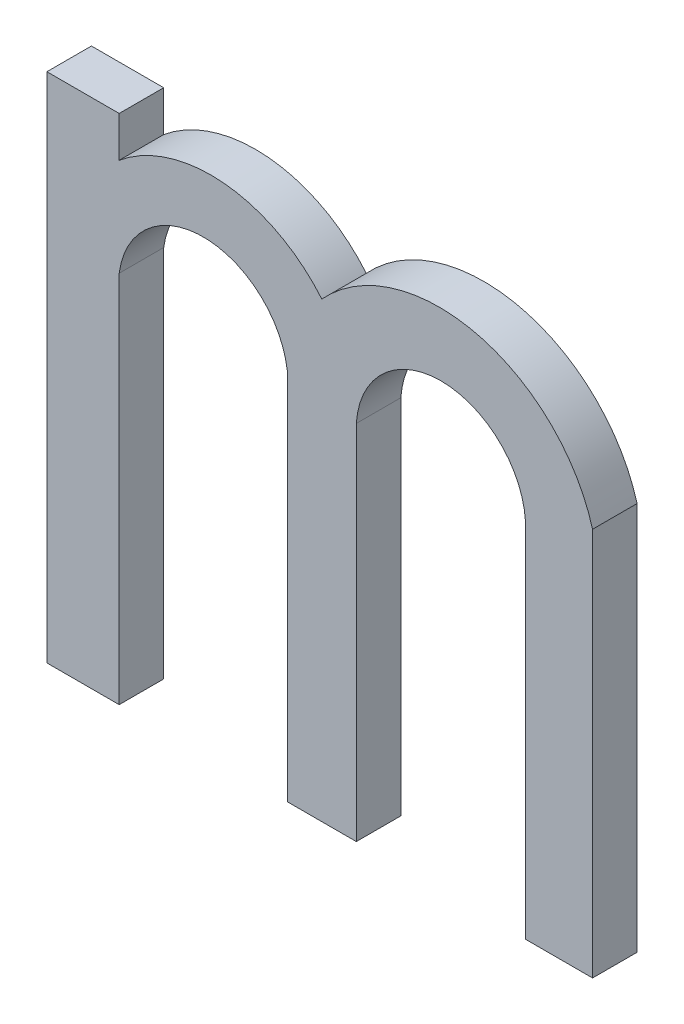
ISO-10303-21;
HEADER;
FILE_DESCRIPTION(('STEP AP214'),'2;1');
FILE_NAME('part.step','',(''),(''),'','','');
FILE_SCHEMA(('AUTOMOTIVE_DESIGN { 1 0 10303 214 1 1 1 1 }'));
ENDSEC;
DATA;
#1=APPLICATION_CONTEXT('core data for automotive mechanical design processes');
#2=APPLICATION_PROTOCOL_DEFINITION('international standard','automotive_design',2000,#1);
#3=PRODUCT_CONTEXT('',#1,'mechanical');
#4=PRODUCT('Part','Part','',(#3));
#5=PRODUCT_RELATED_PRODUCT_CATEGORY('part','',(#4));
#6=PRODUCT_DEFINITION_FORMATION('','',#4);
#7=PRODUCT_DEFINITION_CONTEXT('part definition',#1,'design');
#8=PRODUCT_DEFINITION('design','',#6,#7);
#9=PRODUCT_DEFINITION_SHAPE('','',#8);
#10=(LENGTH_UNIT() NAMED_UNIT(*) SI_UNIT(.MILLI.,.METRE.));
#11=(NAMED_UNIT(*) PLANE_ANGLE_UNIT() SI_UNIT($,.RADIAN.));
#12=(NAMED_UNIT(*) SI_UNIT($,.STERADIAN.) SOLID_ANGLE_UNIT());
#13=UNCERTAINTY_MEASURE_WITH_UNIT(LENGTH_MEASURE(1.E-05),#10,'distance_accuracy_value','');
#14=(GEOMETRIC_REPRESENTATION_CONTEXT(3) GLOBAL_UNCERTAINTY_ASSIGNED_CONTEXT((#13)) GLOBAL_UNIT_ASSIGNED_CONTEXT((#10,
#11,#12)) REPRESENTATION_CONTEXT('',''));
#15=CARTESIAN_POINT('',(0.,0.,0.));
#16=DIRECTION('',(0.,0.,1.));
#17=DIRECTION('',(1.,0.,0.));
#18=AXIS2_PLACEMENT_3D('',#15,#16,#17);
#19=CARTESIAN_POINT('',(0.490687253635956,-0.901080123716433,-0.005));
#20=DIRECTION('',(0.,0.,1.));
#21=DIRECTION('',(1.,0.,0.));
#22=AXIS2_PLACEMENT_3D('',#19,#20,#21);
#23=CYLINDRICAL_SURFACE('',#22,0.0357735525383627);
#24=DIRECTION('',(0.,0.,1.));
#25=VECTOR('',#24,1.);
#26=CARTESIAN_POINT('',(0.464282901755146,-0.876943900669541,-0.005));
#27=LINE('',#26,#25);
#28=CARTESIAN_POINT('',(0.464282901755146,-0.876943900669541,-0.005));
#29=VERTEX_POINT('',#28);
#30=CARTESIAN_POINT('',(0.464282901755146,-0.876943900669541,0.005));
#31=VERTEX_POINT('',#30);
#32=EDGE_CURVE('E11',#29,#31,#27,.T.);
#33=ORIENTED_EDGE('',*,*,#32,.T.);
#34=CARTESIAN_POINT('',(0.490687253635956,-0.901080123716433,0.005));
#35=DIRECTION('',(0.,0.,-1.));
#36=DIRECTION('',(1.,0.,0.));
#37=AXIS2_PLACEMENT_3D('',#34,#35,#36);
#38=CIRCLE('',#37,0.0357735525383627);
#39=CARTESIAN_POINT('',(0.525098674552369,-0.891302538547872,0.005));
#40=VERTEX_POINT('',#39);
#41=EDGE_CURVE('E24',#31,#40,#38,.T.);
#42=ORIENTED_EDGE('',*,*,#41,.T.);
#43=DIRECTION('',(0.,0.,1.));
#44=VECTOR('',#43,1.);
#45=CARTESIAN_POINT('',(0.525098674552369,-0.891302538547872,-0.005));
#46=LINE('',#45,#44);
#47=CARTESIAN_POINT('',(0.525098674552369,-0.891302538547872,-0.005));
#48=VERTEX_POINT('',#47);
#49=EDGE_CURVE('E246',#48,#40,#46,.T.);
#50=ORIENTED_EDGE('',*,*,#49,.F.);
#51=CARTESIAN_POINT('',(0.490687253635956,-0.901080123716433,-0.005));
#52=DIRECTION('',(0.,0.,-1.));
#53=DIRECTION('',(1.,0.,0.));
#54=AXIS2_PLACEMENT_3D('',#51,#52,#53);
#55=CIRCLE('',#54,0.0357735525383627);
#56=EDGE_CURVE('E244',#29,#48,#55,.T.);
#57=ORIENTED_EDGE('',*,*,#56,.F.);
#58=EDGE_LOOP('',(#33,#42,#50,#57));
#59=FACE_BOUND('',#58,.T.);
#60=ADVANCED_FACE('F17',(#59),#23,.T.);
#61=CARTESIAN_POINT('',(0.525098674552368,0.,-0.005));
#62=DIRECTION('',(1.,0.,0.));
#63=DIRECTION('',(0.,1.,0.));
#64=AXIS2_PLACEMENT_3D('',#61,#62,#63);
#65=PLANE('',#64);
#66=ORIENTED_EDGE('',*,*,#49,.T.);
#67=DIRECTION('',(0.,1.,0.));
#68=VECTOR('',#67,1.);
#69=CARTESIAN_POINT('',(0.525098674552368,0.,0.005));
#70=LINE('',#69,#68);
#71=CARTESIAN_POINT('',(0.525098674552369,-0.978587788073794,0.005));
#72=VERTEX_POINT('',#71);
#73=EDGE_CURVE('E241',#72,#40,#70,.T.);
#74=ORIENTED_EDGE('',*,*,#73,.F.);
#75=DIRECTION('',(0.,0.,1.));
#76=VECTOR('',#75,1.);
#77=CARTESIAN_POINT('',(0.525098674552369,-0.978587788073794,-0.005));
#78=LINE('',#77,#76);
#79=CARTESIAN_POINT('',(0.525098674552369,-0.978587788073794,-0.005));
#80=VERTEX_POINT('',#79);
#81=EDGE_CURVE('E238',#80,#72,#78,.T.);
#82=ORIENTED_EDGE('',*,*,#81,.F.);
#83=DIRECTION('',(0.,1.,0.));
#84=VECTOR('',#83,1.);
#85=CARTESIAN_POINT('',(0.525098674552368,0.,-0.005));
#86=LINE('',#85,#84);
#87=EDGE_CURVE('E235',#80,#48,#86,.T.);
#88=ORIENTED_EDGE('',*,*,#87,.T.);
#89=EDGE_LOOP('',(#66,#74,#82,#88));
#90=FACE_BOUND('',#89,.T.);
#91=ADVANCED_FACE('F250',(#90),#65,.T.);
#92=CARTESIAN_POINT('',(0.,-0.978587788073794,-0.005));
#93=DIRECTION('',(0.,1.,0.));
#94=DIRECTION('',(0.,0.,1.));
#95=AXIS2_PLACEMENT_3D('',#92,#93,#94);
#96=PLANE('',#95);
#97=ORIENTED_EDGE('',*,*,#81,.T.);
#98=DIRECTION('',(-1.,0.,0.));
#99=VECTOR('',#98,1.);
#100=CARTESIAN_POINT('',(0.,-0.978587788073794,0.005));
#101=LINE('',#100,#99);
#102=CARTESIAN_POINT('',(0.51002706613578,-0.978587788073794,0.005));
#103=VERTEX_POINT('',#102);
#104=EDGE_CURVE('E233',#72,#103,#101,.T.);
#105=ORIENTED_EDGE('',*,*,#104,.T.);
#106=DIRECTION('',(0.,0.,1.));
#107=VECTOR('',#106,1.);
#108=CARTESIAN_POINT('',(0.51002706613578,-0.978587788073794,-0.005));
#109=LINE('',#108,#107);
#110=CARTESIAN_POINT('',(0.51002706613578,-0.978587788073794,-0.005));
#111=VERTEX_POINT('',#110);
#112=EDGE_CURVE('E230',#111,#103,#109,.T.);
#113=ORIENTED_EDGE('',*,*,#112,.F.);
#114=DIRECTION('',(-1.,0.,0.));
#115=VECTOR('',#114,1.);
#116=CARTESIAN_POINT('',(0.,-0.978587788073794,-0.005));
#117=LINE('',#116,#115);
#118=EDGE_CURVE('E227',#80,#111,#117,.T.);
#119=ORIENTED_EDGE('',*,*,#118,.F.);
#120=EDGE_LOOP('',(#97,#105,#113,#119));
#121=FACE_BOUND('',#120,.T.);
#122=ADVANCED_FACE('F256',(#121),#96,.F.);
#123=CARTESIAN_POINT('',(0.51002706613578,0.,-0.005));
#124=DIRECTION('',(1.,0.,0.));
#125=DIRECTION('',(0.,0.,-1.));
#126=AXIS2_PLACEMENT_3D('',#123,#124,#125);
#127=PLANE('',#126);
#128=ORIENTED_EDGE('',*,*,#112,.T.);
#129=DIRECTION('',(0.,1.,0.));
#130=VECTOR('',#129,1.);
#131=CARTESIAN_POINT('',(0.51002706613578,0.,0.005));
#132=LINE('',#131,#130);
#133=CARTESIAN_POINT('',(0.51002706613578,-0.897255148385557,0.005));
#134=VERTEX_POINT('',#133);
#135=EDGE_CURVE('E225',#103,#134,#132,.T.);
#136=ORIENTED_EDGE('',*,*,#135,.T.);
#137=DIRECTION('',(0.,0.,1.));
#138=VECTOR('',#137,1.);
#139=CARTESIAN_POINT('',(0.51002706613578,-0.897255148385557,-0.005));
#140=LINE('',#139,#138);
#141=CARTESIAN_POINT('',(0.51002706613578,-0.897255148385557,-0.005));
#142=VERTEX_POINT('',#141);
#143=EDGE_CURVE('E222',#142,#134,#140,.T.);
#144=ORIENTED_EDGE('',*,*,#143,.F.);
#145=DIRECTION('',(0.,1.,0.));
#146=VECTOR('',#145,1.);
#147=CARTESIAN_POINT('',(0.51002706613578,0.,-0.005));
#148=LINE('',#147,#146);
#149=EDGE_CURVE('E219',#111,#142,#148,.T.);
#150=ORIENTED_EDGE('',*,*,#149,.F.);
#151=EDGE_LOOP('',(#128,#136,#144,#150));
#152=FACE_BOUND('',#151,.T.);
#153=ADVANCED_FACE('F260',(#152),#127,.F.);
#154=CARTESIAN_POINT('',(0.491031608045504,-0.898499238705807,-0.005));
#155=DIRECTION('',(0.,0.,1.));
#156=DIRECTION('',(1.,0.,0.));
#157=AXIS2_PLACEMENT_3D('',#154,#155,#156);
#158=CYLINDRICAL_SURFACE('',#157,0.0190361547793761);
#159=ORIENTED_EDGE('',*,*,#143,.T.);
#160=CARTESIAN_POINT('',(0.491031608045504,-0.898499238705807,0.005));
#161=DIRECTION('',(0.,0.,-1.));
#162=DIRECTION('',(1.,0.,0.));
#163=AXIS2_PLACEMENT_3D('',#160,#161,#162);
#164=CIRCLE('',#163,0.0190361547793761);
#165=CARTESIAN_POINT('',(0.472036149955228,-0.897255148385558,0.005));
#166=VERTEX_POINT('',#165);
#167=EDGE_CURVE('E216',#166,#134,#164,.T.);
#168=ORIENTED_EDGE('',*,*,#167,.F.);
#169=DIRECTION('',(0.,0.,1.));
#170=VECTOR('',#169,1.);
#171=CARTESIAN_POINT('',(0.472036149955228,-0.897255148385558,-0.005));
#172=LINE('',#171,#170);
#173=CARTESIAN_POINT('',(0.472036149955228,-0.897255148385558,-0.005));
#174=VERTEX_POINT('',#173);
#175=EDGE_CURVE('E214',#174,#166,#172,.T.);
#176=ORIENTED_EDGE('',*,*,#175,.F.);
#177=CARTESIAN_POINT('',(0.491031608045504,-0.898499238705807,-0.005));
#178=DIRECTION('',(0.,0.,-1.));
#179=DIRECTION('',(1.,0.,0.));
#180=AXIS2_PLACEMENT_3D('',#177,#178,#179);
#181=CIRCLE('',#180,0.0190361547793761);
#182=EDGE_CURVE('E211',#174,#142,#181,.T.);
#183=ORIENTED_EDGE('',*,*,#182,.T.);
#184=EDGE_LOOP('',(#159,#168,#176,#183));
#185=FACE_BOUND('',#184,.T.);
#186=ADVANCED_FACE('F264',(#185),#158,.F.);
#187=CARTESIAN_POINT('',(0.472036149955228,0.,-0.005));
#188=DIRECTION('',(1.,0.,0.));
#189=DIRECTION('',(0.,0.,-1.));
#190=AXIS2_PLACEMENT_3D('',#187,#188,#189);
#191=PLANE('',#190);
#192=ORIENTED_EDGE('',*,*,#175,.T.);
#193=DIRECTION('',(0.,1.,0.));
#194=VECTOR('',#193,1.);
#195=CARTESIAN_POINT('',(0.472036149955228,0.,0.005));
#196=LINE('',#195,#194);
#197=CARTESIAN_POINT('',(0.472036149955228,-0.978587788073794,0.005));
#198=VERTEX_POINT('',#197);
#199=EDGE_CURVE('E208',#198,#166,#196,.T.);
#200=ORIENTED_EDGE('',*,*,#199,.F.);
#201=DIRECTION('',(0.,0.,1.));
#202=VECTOR('',#201,1.);
#203=CARTESIAN_POINT('',(0.472036149955228,-0.978587788073794,-0.005));
#204=LINE('',#203,#202);
#205=CARTESIAN_POINT('',(0.472036149955228,-0.978587788073794,-0.005));
#206=VERTEX_POINT('',#205);
#207=EDGE_CURVE('E205',#206,#198,#204,.T.);
#208=ORIENTED_EDGE('',*,*,#207,.F.);
#209=DIRECTION('',(0.,1.,0.));
#210=VECTOR('',#209,1.);
#211=CARTESIAN_POINT('',(0.472036149955228,0.,-0.005));
#212=LINE('',#211,#210);
#213=EDGE_CURVE('E202',#206,#174,#212,.T.);
#214=ORIENTED_EDGE('',*,*,#213,.T.);
#215=EDGE_LOOP('',(#192,#200,#208,#214));
#216=FACE_BOUND('',#215,.T.);
#217=ADVANCED_FACE('F267',(#216),#191,.T.);
#218=CARTESIAN_POINT('',(0.,-0.978587788073794,-0.005));
#219=DIRECTION('',(0.,-1.,0.));
#220=DIRECTION('',(0.,0.,-1.));
#221=AXIS2_PLACEMENT_3D('',#218,#219,#220);
#222=PLANE('',#221);
#223=ORIENTED_EDGE('',*,*,#207,.T.);
#224=DIRECTION('',(1.,0.,0.));
#225=VECTOR('',#224,1.);
#226=CARTESIAN_POINT('',(0.,-0.978587788073794,0.005));
#227=LINE('',#226,#225);
#228=CARTESIAN_POINT('',(0.456529653555003,-0.978587788073794,0.005));
#229=VERTEX_POINT('',#228);
#230=EDGE_CURVE('E199',#229,#198,#227,.T.);
#231=ORIENTED_EDGE('',*,*,#230,.F.);
#232=DIRECTION('',(0.,0.,1.));
#233=VECTOR('',#232,1.);
#234=CARTESIAN_POINT('',(0.456529653555003,-0.978587788073794,-0.005));
#235=LINE('',#234,#233);
#236=CARTESIAN_POINT('',(0.456529653555003,-0.978587788073794,-0.005));
#237=VERTEX_POINT('',#236);
#238=EDGE_CURVE('E196',#237,#229,#235,.T.);
#239=ORIENTED_EDGE('',*,*,#238,.F.);
#240=DIRECTION('',(1.,0.,0.));
#241=VECTOR('',#240,1.);
#242=CARTESIAN_POINT('',(0.,-0.978587788073794,-0.005));
#243=LINE('',#242,#241);
#244=EDGE_CURVE('E193',#237,#206,#243,.T.);
#245=ORIENTED_EDGE('',*,*,#244,.T.);
#246=EDGE_LOOP('',(#223,#231,#239,#245));
#247=FACE_BOUND('',#246,.T.);
#248=ADVANCED_FACE('F271',(#247),#222,.T.);
#249=CARTESIAN_POINT('',(0.456529653555003,0.,-0.005));
#250=DIRECTION('',(1.,0.,0.));
#251=DIRECTION('',(0.,0.,-1.));
#252=AXIS2_PLACEMENT_3D('',#249,#250,#251);
#253=PLANE('',#252);
#254=ORIENTED_EDGE('',*,*,#238,.T.);
#255=DIRECTION('',(0.,1.,0.));
#256=VECTOR('',#255,1.);
#257=CARTESIAN_POINT('',(0.456529653555003,0.,0.005));
#258=LINE('',#257,#256);
#259=CARTESIAN_POINT('',(0.456529653555003,-0.894671181364844,0.005));
#260=VERTEX_POINT('',#259);
#261=EDGE_CURVE('E191',#229,#260,#258,.T.);
#262=ORIENTED_EDGE('',*,*,#261,.T.);
#263=DIRECTION('',(0.,0.,1.));
#264=VECTOR('',#263,1.);
#265=CARTESIAN_POINT('',(0.456529653555003,-0.894671181364844,-0.005));
#266=LINE('',#265,#264);
#267=CARTESIAN_POINT('',(0.456529653555003,-0.894671181364844,-0.005));
#268=VERTEX_POINT('',#267);
#269=EDGE_CURVE('E188',#268,#260,#266,.T.);
#270=ORIENTED_EDGE('',*,*,#269,.F.);
#271=DIRECTION('',(0.,1.,0.));
#272=VECTOR('',#271,1.);
#273=CARTESIAN_POINT('',(0.456529653555003,0.,-0.005));
#274=LINE('',#273,#272);
#275=EDGE_CURVE('E185',#237,#268,#274,.T.);
#276=ORIENTED_EDGE('',*,*,#275,.F.);
#277=EDGE_LOOP('',(#254,#262,#270,#276));
#278=FACE_BOUND('',#277,.T.);
#279=ADVANCED_FACE('F274',(#278),#253,.F.);
#280=CARTESIAN_POINT('',(0.437653191428051,-0.89720725519545,-0.005));
#281=DIRECTION('',(0.,0.,1.));
#282=DIRECTION('',(1.,0.,0.));
#283=AXIS2_PLACEMENT_3D('',#280,#281,#282);
#284=CYLINDRICAL_SURFACE('',#283,0.0190460623989458);
#285=ORIENTED_EDGE('',*,*,#269,.T.);
#286=CARTESIAN_POINT('',(0.437653191428051,-0.89720725519545,0.005));
#287=DIRECTION('',(0.,0.,-1.));
#288=DIRECTION('',(1.,0.,0.));
#289=AXIS2_PLACEMENT_3D('',#286,#287,#288);
#290=CIRCLE('',#289,0.0190460623989458);
#291=CARTESIAN_POINT('',(0.418776729301099,-0.894671181364844,0.005));
#292=VERTEX_POINT('',#291);
#293=EDGE_CURVE('E182',#292,#260,#290,.T.);
#294=ORIENTED_EDGE('',*,*,#293,.F.);
#295=DIRECTION('',(0.,0.,1.));
#296=VECTOR('',#295,1.);
#297=CARTESIAN_POINT('',(0.418776729301099,-0.894671181364844,-0.005));
#298=LINE('',#297,#296);
#299=CARTESIAN_POINT('',(0.418776729301099,-0.894671181364844,-0.005));
#300=VERTEX_POINT('',#299);
#301=EDGE_CURVE('E180',#300,#292,#298,.T.);
#302=ORIENTED_EDGE('',*,*,#301,.F.);
#303=CARTESIAN_POINT('',(0.437653191428051,-0.89720725519545,-0.005));
#304=DIRECTION('',(0.,0.,-1.));
#305=DIRECTION('',(1.,0.,0.));
#306=AXIS2_PLACEMENT_3D('',#303,#304,#305);
#307=CIRCLE('',#306,0.0190460623989458);
#308=EDGE_CURVE('E177',#300,#268,#307,.T.);
#309=ORIENTED_EDGE('',*,*,#308,.T.);
#310=EDGE_LOOP('',(#285,#294,#302,#309));
#311=FACE_BOUND('',#310,.T.);
#312=ADVANCED_FACE('F278',(#311),#284,.F.);
#313=CARTESIAN_POINT('',(0.418776729301099,0.,-0.005));
#314=DIRECTION('',(1.,0.,0.));
#315=DIRECTION('',(0.,0.,-1.));
#316=AXIS2_PLACEMENT_3D('',#313,#314,#315);
#317=PLANE('',#316);
#318=ORIENTED_EDGE('',*,*,#301,.T.);
#319=DIRECTION('',(0.,1.,0.));
#320=VECTOR('',#319,1.);
#321=CARTESIAN_POINT('',(0.418776729301099,0.,0.005));
#322=LINE('',#321,#320);
#323=CARTESIAN_POINT('',(0.418776729301099,-0.978587788073793,0.005));
#324=VERTEX_POINT('',#323);
#325=EDGE_CURVE('E174',#324,#292,#322,.T.);
#326=ORIENTED_EDGE('',*,*,#325,.F.);
#327=DIRECTION('',(0.,0.,1.));
#328=VECTOR('',#327,1.);
#329=CARTESIAN_POINT('',(0.418776729301099,-0.978587788073793,-0.005));
#330=LINE('',#329,#328);
#331=CARTESIAN_POINT('',(0.418776729301099,-0.978587788073793,-0.005));
#332=VERTEX_POINT('',#331);
#333=EDGE_CURVE('E171',#332,#324,#330,.T.);
#334=ORIENTED_EDGE('',*,*,#333,.F.);
#335=DIRECTION('',(0.,1.,0.));
#336=VECTOR('',#335,1.);
#337=CARTESIAN_POINT('',(0.418776729301099,0.,-0.005));
#338=LINE('',#337,#336);
#339=EDGE_CURVE('E168',#332,#300,#338,.T.);
#340=ORIENTED_EDGE('',*,*,#339,.T.);
#341=EDGE_LOOP('',(#318,#326,#334,#340));
#342=FACE_BOUND('',#341,.T.);
#343=ADVANCED_FACE('F319',(#342),#317,.T.);
#344=CARTESIAN_POINT('',(0.,-0.978587788073793,-0.005));
#345=DIRECTION('',(0.,-1.,0.));
#346=DIRECTION('',(0.,0.,-1.));
#347=AXIS2_PLACEMENT_3D('',#344,#345,#346);
#348=PLANE('',#347);
#349=ORIENTED_EDGE('',*,*,#333,.T.);
#350=DIRECTION('',(1.,0.,0.));
#351=VECTOR('',#350,1.);
#352=CARTESIAN_POINT('',(0.,-0.978587788073793,0.005));
#353=LINE('',#352,#351);
#354=CARTESIAN_POINT('',(0.402544372421268,-0.978587788073793,0.005));
#355=VERTEX_POINT('',#354);
#356=EDGE_CURVE('E165',#355,#324,#353,.T.);
#357=ORIENTED_EDGE('',*,*,#356,.F.);
#358=DIRECTION('',(0.,0.,1.));
#359=VECTOR('',#358,1.);
#360=CARTESIAN_POINT('',(0.402544372421268,-0.978587788073793,-0.005));
#361=LINE('',#360,#359);
#362=CARTESIAN_POINT('',(0.402544372421268,-0.978587788073793,-0.005));
#363=VERTEX_POINT('',#362);
#364=EDGE_CURVE('E162',#363,#355,#361,.T.);
#365=ORIENTED_EDGE('',*,*,#364,.F.);
#366=DIRECTION('',(1.,0.,0.));
#367=VECTOR('',#366,1.);
#368=CARTESIAN_POINT('',(0.,-0.978587788073793,-0.005));
#369=LINE('',#368,#367);
#370=EDGE_CURVE('E159',#363,#332,#369,.T.);
#371=ORIENTED_EDGE('',*,*,#370,.T.);
#372=EDGE_LOOP('',(#349,#357,#365,#371));
#373=FACE_BOUND('',#372,.T.);
#374=ADVANCED_FACE('F283',(#373),#348,.T.);
#375=CARTESIAN_POINT('',(0.402544372421268,0.,-0.005));
#376=DIRECTION('',(-1.,0.,0.));
#377=DIRECTION('',(0.,0.,1.));
#378=AXIS2_PLACEMENT_3D('',#375,#376,#377);
#379=PLANE('',#378);
#380=ORIENTED_EDGE('',*,*,#364,.T.);
#381=DIRECTION('',(0.,-1.,0.));
#382=VECTOR('',#381,1.);
#383=CARTESIAN_POINT('',(0.402544372421268,0.,0.005));
#384=LINE('',#383,#382);
#385=CARTESIAN_POINT('',(0.402544372421268,-0.863587788073793,0.005));
#386=VERTEX_POINT('',#385);
#387=EDGE_CURVE('E156',#386,#355,#384,.T.);
#388=ORIENTED_EDGE('',*,*,#387,.F.);
#389=DIRECTION('',(0.,0.,1.));
#390=VECTOR('',#389,1.);
#391=CARTESIAN_POINT('',(0.402544372421268,-0.863587788073793,-0.005));
#392=LINE('',#391,#390);
#393=CARTESIAN_POINT('',(0.402544372421268,-0.863587788073793,-0.005));
#394=VERTEX_POINT('',#393);
#395=EDGE_CURVE('E153',#394,#386,#392,.T.);
#396=ORIENTED_EDGE('',*,*,#395,.F.);
#397=DIRECTION('',(0.,-1.,0.));
#398=VECTOR('',#397,1.);
#399=CARTESIAN_POINT('',(0.402544372421268,0.,-0.005));
#400=LINE('',#399,#398);
#401=EDGE_CURVE('E150',#394,#363,#400,.T.);
#402=ORIENTED_EDGE('',*,*,#401,.T.);
#403=EDGE_LOOP('',(#380,#388,#396,#402));
#404=FACE_BOUND('',#403,.T.);
#405=ADVANCED_FACE('F285',(#404),#379,.T.);
#406=CARTESIAN_POINT('',(0.,-0.863587788073793,-0.005));
#407=DIRECTION('',(0.,-1.,0.));
#408=DIRECTION('',(0.,0.,-1.));
#409=AXIS2_PLACEMENT_3D('',#406,#407,#408);
#410=PLANE('',#409);
#411=ORIENTED_EDGE('',*,*,#395,.T.);
#412=DIRECTION('',(1.,0.,0.));
#413=VECTOR('',#412,1.);
#414=CARTESIAN_POINT('',(0.,-0.863587788073793,0.005));
#415=LINE('',#414,#413);
#416=CARTESIAN_POINT('',(0.418776729301038,-0.863587788073793,0.005));
#417=VERTEX_POINT('',#416);
#418=EDGE_CURVE('E148',#386,#417,#415,.T.);
#419=ORIENTED_EDGE('',*,*,#418,.T.);
#420=DIRECTION('',(0.,0.,1.));
#421=VECTOR('',#420,1.);
#422=CARTESIAN_POINT('',(0.418776729301038,-0.863587788073793,-0.005));
#423=LINE('',#422,#421);
#424=CARTESIAN_POINT('',(0.418776729301038,-0.863587788073793,-0.005));
#425=VERTEX_POINT('',#424);
#426=EDGE_CURVE('E146',#425,#417,#423,.T.);
#427=ORIENTED_EDGE('',*,*,#426,.F.);
#428=DIRECTION('',(1.,0.,0.));
#429=VECTOR('',#428,1.);
#430=CARTESIAN_POINT('',(0.,-0.863587788073793,-0.005));
#431=LINE('',#430,#429);
#432=EDGE_CURVE('E137',#394,#425,#431,.T.);
#433=ORIENTED_EDGE('',*,*,#432,.F.);
#434=EDGE_LOOP('',(#411,#419,#427,#433));
#435=FACE_BOUND('',#434,.T.);
#436=ADVANCED_FACE('F288',(#435),#410,.F.);
#437=CARTESIAN_POINT('',(0.418776729301038,0.,-0.005));
#438=DIRECTION('',(-1.,0.,0.));
#439=DIRECTION('',(0.,0.,1.));
#440=AXIS2_PLACEMENT_3D('',#437,#438,#439);
#441=PLANE('',#440);
#442=ORIENTED_EDGE('',*,*,#426,.T.);
#443=DIRECTION('',(0.,-1.,0.));
#444=VECTOR('',#443,1.);
#445=CARTESIAN_POINT('',(0.418776729301038,0.,0.005));
#446=LINE('',#445,#444);
#447=CARTESIAN_POINT('',(0.418776729301038,-0.872701287990746,0.005));
#448=VERTEX_POINT('',#447);
#449=EDGE_CURVE('E126',#417,#448,#446,.T.);
#450=ORIENTED_EDGE('',*,*,#449,.T.);
#451=DIRECTION('',(0.,0.,1.));
#452=VECTOR('',#451,1.);
#453=CARTESIAN_POINT('',(0.418776729301038,-0.872701287990746,-0.005));
#454=LINE('',#453,#452);
#455=CARTESIAN_POINT('',(0.418776729301038,-0.872701287990746,-0.005));
#456=VERTEX_POINT('',#455);
#457=EDGE_CURVE('E120',#456,#448,#454,.T.);
#458=ORIENTED_EDGE('',*,*,#457,.F.);
#459=DIRECTION('',(0.,-1.,0.));
#460=VECTOR('',#459,1.);
#461=CARTESIAN_POINT('',(0.418776729301038,0.,-0.005));
#462=LINE('',#461,#460);
#463=EDGE_CURVE('E124',#425,#456,#462,.T.);
#464=ORIENTED_EDGE('',*,*,#463,.F.);
#465=EDGE_LOOP('',(#442,#450,#458,#464));
#466=FACE_BOUND('',#465,.T.);
#467=ADVANCED_FACE('F123',(#466),#441,.F.);
#468=CARTESIAN_POINT('',(0.439408509188697,-0.897575680557165,-0.005));
#469=DIRECTION('',(0.,0.,1.));
#470=DIRECTION('',(1.,0.,0.));
#471=AXIS2_PLACEMENT_3D('',#468,#469,#470);
#472=CYLINDRICAL_SURFACE('',#471,0.0323172670082286);
#473=ORIENTED_EDGE('',*,*,#457,.T.);
#474=CARTESIAN_POINT('',(0.439408509188697,-0.897575680557165,0.005));
#475=DIRECTION('',(0.,0.,-1.));
#476=DIRECTION('',(1.,0.,0.));
#477=AXIS2_PLACEMENT_3D('',#474,#475,#476);
#478=CIRCLE('',#477,0.0323172670082286);
#479=EDGE_CURVE('E138',#448,#31,#478,.T.);
#480=ORIENTED_EDGE('',*,*,#479,.T.);
#481=ORIENTED_EDGE('',*,*,#32,.F.);
#482=CARTESIAN_POINT('',(0.439408509188697,-0.897575680557165,-0.005));
#483=DIRECTION('',(0.,0.,-1.));
#484=DIRECTION('',(1.,0.,0.));
#485=AXIS2_PLACEMENT_3D('',#482,#483,#484);
#486=CIRCLE('',#485,0.0323172670082286);
#487=EDGE_CURVE('E134',#456,#29,#486,.T.);
#488=ORIENTED_EDGE('',*,*,#487,.F.);
#489=EDGE_LOOP('',(#473,#480,#481,#488));
#490=FACE_BOUND('',#489,.T.);
#491=ADVANCED_FACE('F140',(#490),#472,.T.);
#492=CARTESIAN_POINT('',(0.,0.,-0.005));
#493=DIRECTION('',(0.,0.,1.));
#494=DIRECTION('',(1.,0.,0.));
#495=AXIS2_PLACEMENT_3D('',#492,#493,#494);
#496=PLANE('',#495);
#497=ORIENTED_EDGE('',*,*,#56,.T.);
#498=ORIENTED_EDGE('',*,*,#87,.F.);
#499=ORIENTED_EDGE('',*,*,#118,.T.);
#500=ORIENTED_EDGE('',*,*,#149,.T.);
#501=ORIENTED_EDGE('',*,*,#182,.F.);
#502=ORIENTED_EDGE('',*,*,#213,.F.);
#503=ORIENTED_EDGE('',*,*,#244,.F.);
#504=ORIENTED_EDGE('',*,*,#275,.T.);
#505=ORIENTED_EDGE('',*,*,#308,.F.);
#506=ORIENTED_EDGE('',*,*,#339,.F.);
#507=ORIENTED_EDGE('',*,*,#370,.F.);
#508=ORIENTED_EDGE('',*,*,#401,.F.);
#509=ORIENTED_EDGE('',*,*,#432,.T.);
#510=ORIENTED_EDGE('',*,*,#463,.T.);
#511=ORIENTED_EDGE('',*,*,#487,.T.);
#512=EDGE_LOOP('',(#497,#498,#499,#500,#501,#502,#503,#504,#505,#506,#507,#508,#509,#510,#511));
#513=FACE_BOUND('',#512,.T.);
#514=ADVANCED_FACE('F133',(#513),#496,.F.);
#515=CARTESIAN_POINT('',(0.,0.,0.005));
#516=DIRECTION('',(0.,0.,1.));
#517=DIRECTION('',(1.,0.,0.));
#518=AXIS2_PLACEMENT_3D('',#515,#516,#517);
#519=PLANE('',#518);
#520=ORIENTED_EDGE('',*,*,#41,.F.);
#521=ORIENTED_EDGE('',*,*,#479,.F.);
#522=ORIENTED_EDGE('',*,*,#449,.F.);
#523=ORIENTED_EDGE('',*,*,#418,.F.);
#524=ORIENTED_EDGE('',*,*,#387,.T.);
#525=ORIENTED_EDGE('',*,*,#356,.T.);
#526=ORIENTED_EDGE('',*,*,#325,.T.);
#527=ORIENTED_EDGE('',*,*,#293,.T.);
#528=ORIENTED_EDGE('',*,*,#261,.F.);
#529=ORIENTED_EDGE('',*,*,#230,.T.);
#530=ORIENTED_EDGE('',*,*,#199,.T.);
#531=ORIENTED_EDGE('',*,*,#167,.T.);
#532=ORIENTED_EDGE('',*,*,#135,.F.);
#533=ORIENTED_EDGE('',*,*,#104,.F.);
#534=ORIENTED_EDGE('',*,*,#73,.T.);
#535=EDGE_LOOP('',(#520,#521,#522,#523,#524,#525,#526,#527,#528,#529,#530,#531,#532,#533,#534));
#536=FACE_BOUND('',#535,.T.);
#537=ADVANCED_FACE('F253',(#536),#519,.T.);
#538=CLOSED_SHELL('',(#60,#91,#122,#153,#186,#217,#248,#279,#312,#343,#374,#405,#436,#467,#491,
#514,#537));
#539=MANIFOLD_SOLID_BREP('B1',#538);
#540=ADVANCED_BREP_SHAPE_REPRESENTATION('',(#18,#539),#14);
#541=SHAPE_DEFINITION_REPRESENTATION(#9,#540);
ENDSEC;
END-ISO-10303-21;
